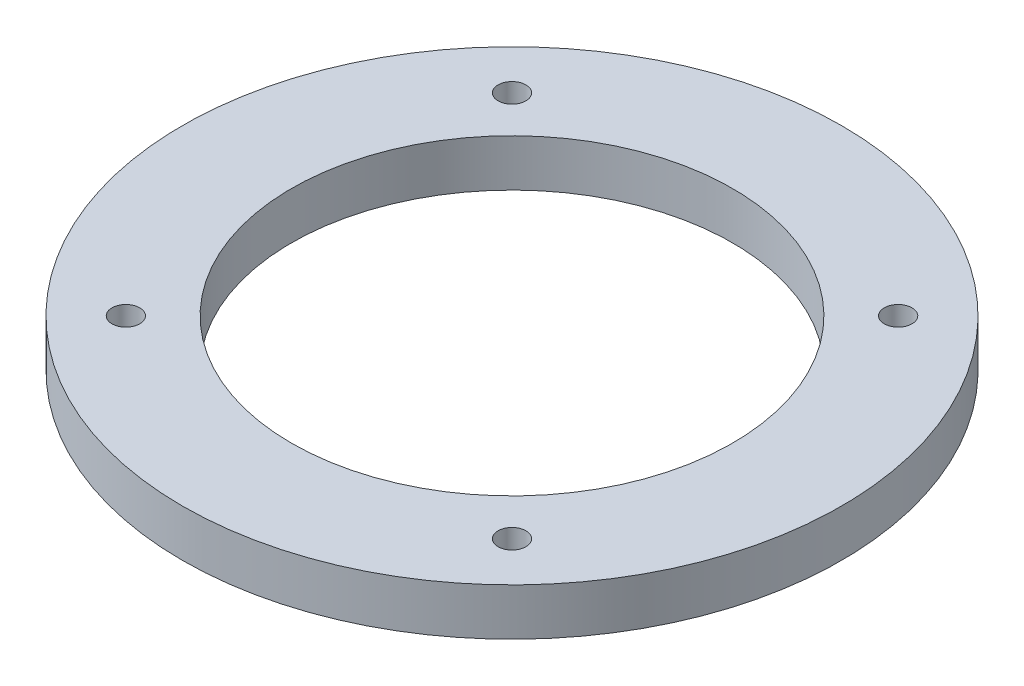
ISO-10303-21;
HEADER;
FILE_DESCRIPTION(('STEP AP214'),'2;1');
FILE_NAME('part.step','',(''),(''),'','','');
FILE_SCHEMA(('AUTOMOTIVE_DESIGN { 1 0 10303 214 1 1 1 1 }'));
ENDSEC;
DATA;
#1=APPLICATION_CONTEXT('core data for automotive mechanical design processes');
#2=APPLICATION_PROTOCOL_DEFINITION('international standard','automotive_design',2000,#1);
#3=PRODUCT_CONTEXT('',#1,'mechanical');
#4=PRODUCT('Part','Part','',(#3));
#5=PRODUCT_RELATED_PRODUCT_CATEGORY('part','',(#4));
#6=PRODUCT_DEFINITION_FORMATION('','',#4);
#7=PRODUCT_DEFINITION_CONTEXT('part definition',#1,'design');
#8=PRODUCT_DEFINITION('design','',#6,#7);
#9=PRODUCT_DEFINITION_SHAPE('','',#8);
#10=(LENGTH_UNIT() NAMED_UNIT(*) SI_UNIT(.MILLI.,.METRE.));
#11=(NAMED_UNIT(*) PLANE_ANGLE_UNIT() SI_UNIT($,.RADIAN.));
#12=(NAMED_UNIT(*) SI_UNIT($,.STERADIAN.) SOLID_ANGLE_UNIT());
#13=UNCERTAINTY_MEASURE_WITH_UNIT(LENGTH_MEASURE(1.E-05),#10,'distance_accuracy_value','');
#14=(GEOMETRIC_REPRESENTATION_CONTEXT(3) GLOBAL_UNCERTAINTY_ASSIGNED_CONTEXT((#13)) GLOBAL_UNIT_ASSIGNED_CONTEXT((#10,
#11,#12)) REPRESENTATION_CONTEXT('',''));
#15=CARTESIAN_POINT('',(0.,0.,0.));
#16=DIRECTION('',(0.,0.,1.));
#17=DIRECTION('',(1.,0.,0.));
#18=AXIS2_PLACEMENT_3D('',#15,#16,#17);
#19=CARTESIAN_POINT('',(0.,2.5,0.));
#20=DIRECTION('',(0.,1.,0.));
#21=DIRECTION('',(0.,0.,1.));
#22=AXIS2_PLACEMENT_3D('',#19,#20,#21);
#23=PLANE('',#22);
#24=CARTESIAN_POINT('',(20.505,2.5,20.505));
#25=DIRECTION('',(0.,1.,0.));
#26=DIRECTION('',(0.,0.,1.));
#27=AXIS2_PLACEMENT_3D('',#24,#25,#26);
#28=CIRCLE('',#27,1.475);
#29=CARTESIAN_POINT('',(20.505,2.5,21.98));
#30=VERTEX_POINT('',#29);
#31=EDGE_CURVE('E66',#30,#30,#28,.T.);
#32=ORIENTED_EDGE('',*,*,#31,.F.);
#33=EDGE_LOOP('',(#32));
#34=FACE_BOUND('',#33,.T.);
#35=CARTESIAN_POINT('',(-20.505,2.5,-20.505));
#36=DIRECTION('',(0.,1.,0.));
#37=DIRECTION('',(0.,0.,1.));
#38=AXIS2_PLACEMENT_3D('',#35,#36,#37);
#39=CIRCLE('',#38,1.475);
#40=CARTESIAN_POINT('',(-20.505,2.5,-19.03));
#41=VERTEX_POINT('',#40);
#42=EDGE_CURVE('E54',#41,#41,#39,.T.);
#43=ORIENTED_EDGE('',*,*,#42,.F.);
#44=EDGE_LOOP('',(#43));
#45=FACE_BOUND('',#44,.T.);
#46=CARTESIAN_POINT('',(0.,2.5,0.));
#47=DIRECTION('',(0.,1.,0.));
#48=DIRECTION('',(0.,0.,1.));
#49=AXIS2_PLACEMENT_3D('',#46,#47,#48);
#50=CIRCLE('',#49,35.);
#51=CARTESIAN_POINT('',(0.,2.5,35.));
#52=VERTEX_POINT('',#51);
#53=EDGE_CURVE('E10',#52,#52,#50,.T.);
#54=ORIENTED_EDGE('',*,*,#53,.T.);
#55=EDGE_LOOP('',(#54));
#56=FACE_BOUND('',#55,.T.);
#57=CARTESIAN_POINT('',(0.,2.5,0.));
#58=DIRECTION('',(0.,1.,0.));
#59=DIRECTION('',(0.,0.,1.));
#60=AXIS2_PLACEMENT_3D('',#57,#58,#59);
#61=CIRCLE('',#60,23.425);
#62=CARTESIAN_POINT('',(0.,2.5,23.425));
#63=VERTEX_POINT('',#62);
#64=EDGE_CURVE('E49',#63,#63,#61,.T.);
#65=ORIENTED_EDGE('',*,*,#64,.F.);
#66=EDGE_LOOP('',(#65));
#67=FACE_BOUND('',#66,.T.);
#68=CARTESIAN_POINT('',(20.505,2.5,-20.505));
#69=DIRECTION('',(0.,1.,0.));
#70=DIRECTION('',(0.,0.,-1.));
#71=AXIS2_PLACEMENT_3D('',#68,#69,#70);
#72=CIRCLE('',#71,1.475);
#73=CARTESIAN_POINT('',(20.505,2.5,-21.98));
#74=VERTEX_POINT('',#73);
#75=EDGE_CURVE('E60',#74,#74,#72,.T.);
#76=ORIENTED_EDGE('',*,*,#75,.F.);
#77=EDGE_LOOP('',(#76));
#78=FACE_BOUND('',#77,.T.);
#79=CARTESIAN_POINT('',(-20.505,2.5,20.505));
#80=DIRECTION('',(0.,1.,0.));
#81=DIRECTION('',(0.,0.,-1.));
#82=AXIS2_PLACEMENT_3D('',#79,#80,#81);
#83=CIRCLE('',#82,1.475);
#84=CARTESIAN_POINT('',(-20.505,2.5,19.03));
#85=VERTEX_POINT('',#84);
#86=EDGE_CURVE('E72',#85,#85,#83,.T.);
#87=ORIENTED_EDGE('',*,*,#86,.F.);
#88=EDGE_LOOP('',(#87));
#89=FACE_BOUND('',#88,.T.);
#90=ADVANCED_FACE('F38',(#34,#45,#56,#67,#78,#89),#23,.T.);
#91=CARTESIAN_POINT('',(0.,-2.5,0.));
#92=DIRECTION('',(0.,1.,0.));
#93=DIRECTION('',(0.,0.,1.));
#94=AXIS2_PLACEMENT_3D('',#91,#92,#93);
#95=PLANE('',#94);
#96=CARTESIAN_POINT('',(0.,-2.5,0.));
#97=DIRECTION('',(0.,1.,0.));
#98=DIRECTION('',(0.,0.,1.));
#99=AXIS2_PLACEMENT_3D('',#96,#97,#98);
#100=CIRCLE('',#99,35.);
#101=CARTESIAN_POINT('',(0.,-2.5,35.));
#102=VERTEX_POINT('',#101);
#103=EDGE_CURVE('E42',#102,#102,#100,.T.);
#104=ORIENTED_EDGE('',*,*,#103,.F.);
#105=EDGE_LOOP('',(#104));
#106=FACE_BOUND('',#105,.T.);
#107=CARTESIAN_POINT('',(0.,-2.5,0.));
#108=DIRECTION('',(0.,1.,0.));
#109=DIRECTION('',(0.,0.,1.));
#110=AXIS2_PLACEMENT_3D('',#107,#108,#109);
#111=CIRCLE('',#110,23.425);
#112=CARTESIAN_POINT('',(0.,-2.5,23.425));
#113=VERTEX_POINT('',#112);
#114=EDGE_CURVE('E51',#113,#113,#111,.T.);
#115=ORIENTED_EDGE('',*,*,#114,.T.);
#116=EDGE_LOOP('',(#115));
#117=FACE_BOUND('',#116,.T.);
#118=CARTESIAN_POINT('',(-20.505,-2.5,-20.505));
#119=DIRECTION('',(0.,1.,0.));
#120=DIRECTION('',(0.,0.,1.));
#121=AXIS2_PLACEMENT_3D('',#118,#119,#120);
#122=CIRCLE('',#121,1.475);
#123=CARTESIAN_POINT('',(-20.505,-2.5,-19.03));
#124=VERTEX_POINT('',#123);
#125=EDGE_CURVE('E57',#124,#124,#122,.T.);
#126=ORIENTED_EDGE('',*,*,#125,.T.);
#127=EDGE_LOOP('',(#126));
#128=FACE_BOUND('',#127,.T.);
#129=CARTESIAN_POINT('',(20.505,-2.5,-20.505));
#130=DIRECTION('',(0.,1.,0.));
#131=DIRECTION('',(0.,0.,-1.));
#132=AXIS2_PLACEMENT_3D('',#129,#130,#131);
#133=CIRCLE('',#132,1.475);
#134=CARTESIAN_POINT('',(20.505,-2.5,-21.98));
#135=VERTEX_POINT('',#134);
#136=EDGE_CURVE('E63',#135,#135,#133,.T.);
#137=ORIENTED_EDGE('',*,*,#136,.T.);
#138=EDGE_LOOP('',(#137));
#139=FACE_BOUND('',#138,.T.);
#140=CARTESIAN_POINT('',(20.505,-2.5,20.505));
#141=DIRECTION('',(0.,1.,0.));
#142=DIRECTION('',(0.,0.,1.));
#143=AXIS2_PLACEMENT_3D('',#140,#141,#142);
#144=CIRCLE('',#143,1.475);
#145=CARTESIAN_POINT('',(20.505,-2.5,21.98));
#146=VERTEX_POINT('',#145);
#147=EDGE_CURVE('E69',#146,#146,#144,.T.);
#148=ORIENTED_EDGE('',*,*,#147,.T.);
#149=EDGE_LOOP('',(#148));
#150=FACE_BOUND('',#149,.T.);
#151=CARTESIAN_POINT('',(-20.505,-2.5,20.505));
#152=DIRECTION('',(0.,1.,0.));
#153=DIRECTION('',(0.,0.,-1.));
#154=AXIS2_PLACEMENT_3D('',#151,#152,#153);
#155=CIRCLE('',#154,1.475);
#156=CARTESIAN_POINT('',(-20.505,-2.5,19.03));
#157=VERTEX_POINT('',#156);
#158=EDGE_CURVE('E75',#157,#157,#155,.T.);
#159=ORIENTED_EDGE('',*,*,#158,.T.);
#160=EDGE_LOOP('',(#159));
#161=FACE_BOUND('',#160,.T.);
#162=ADVANCED_FACE('F85',(#106,#117,#128,#139,#150,#161),#95,.F.);
#163=CARTESIAN_POINT('',(0.,2.5,0.));
#164=DIRECTION('',(0.,-1.,0.));
#165=DIRECTION('',(0.,0.,-1.));
#166=AXIS2_PLACEMENT_3D('',#163,#164,#165);
#167=CYLINDRICAL_SURFACE('',#166,35.);
#168=ORIENTED_EDGE('',*,*,#53,.F.);
#169=EDGE_LOOP('',(#168));
#170=FACE_BOUND('',#169,.T.);
#171=ORIENTED_EDGE('',*,*,#103,.T.);
#172=EDGE_LOOP('',(#171));
#173=FACE_BOUND('',#172,.T.);
#174=ADVANCED_FACE('F40',(#170,#173),#167,.T.);
#175=CARTESIAN_POINT('',(0.,2.5,0.));
#176=DIRECTION('',(0.,-1.,0.));
#177=DIRECTION('',(0.,0.,-1.));
#178=AXIS2_PLACEMENT_3D('',#175,#176,#177);
#179=CYLINDRICAL_SURFACE('',#178,23.425);
#180=ORIENTED_EDGE('',*,*,#64,.T.);
#181=EDGE_LOOP('',(#180));
#182=FACE_BOUND('',#181,.T.);
#183=ORIENTED_EDGE('',*,*,#114,.F.);
#184=EDGE_LOOP('',(#183));
#185=FACE_BOUND('',#184,.T.);
#186=ADVANCED_FACE('F95',(#182,#185),#179,.F.);
#187=CARTESIAN_POINT('',(-20.505,2.5,-20.505));
#188=DIRECTION('',(0.,-1.,0.));
#189=DIRECTION('',(0.,0.,-1.));
#190=AXIS2_PLACEMENT_3D('',#187,#188,#189);
#191=CYLINDRICAL_SURFACE('',#190,1.475);
#192=ORIENTED_EDGE('',*,*,#42,.T.);
#193=EDGE_LOOP('',(#192));
#194=FACE_BOUND('',#193,.T.);
#195=ORIENTED_EDGE('',*,*,#125,.F.);
#196=EDGE_LOOP('',(#195));
#197=FACE_BOUND('',#196,.T.);
#198=ADVANCED_FACE('F98',(#194,#197),#191,.F.);
#199=CARTESIAN_POINT('',(20.505,2.5,-20.505));
#200=DIRECTION('',(0.,-1.,0.));
#201=DIRECTION('',(0.,0.,-1.));
#202=AXIS2_PLACEMENT_3D('',#199,#200,#201);
#203=CYLINDRICAL_SURFACE('',#202,1.475);
#204=ORIENTED_EDGE('',*,*,#75,.T.);
#205=EDGE_LOOP('',(#204));
#206=FACE_BOUND('',#205,.T.);
#207=ORIENTED_EDGE('',*,*,#136,.F.);
#208=EDGE_LOOP('',(#207));
#209=FACE_BOUND('',#208,.T.);
#210=ADVANCED_FACE('F102',(#206,#209),#203,.F.);
#211=CARTESIAN_POINT('',(20.505,2.5,20.505));
#212=DIRECTION('',(0.,-1.,0.));
#213=DIRECTION('',(0.,0.,-1.));
#214=AXIS2_PLACEMENT_3D('',#211,#212,#213);
#215=CYLINDRICAL_SURFACE('',#214,1.475);
#216=ORIENTED_EDGE('',*,*,#31,.T.);
#217=EDGE_LOOP('',(#216));
#218=FACE_BOUND('',#217,.T.);
#219=ORIENTED_EDGE('',*,*,#147,.F.);
#220=EDGE_LOOP('',(#219));
#221=FACE_BOUND('',#220,.T.);
#222=ADVANCED_FACE('F106',(#218,#221),#215,.F.);
#223=CARTESIAN_POINT('',(-20.505,2.5,20.505));
#224=DIRECTION('',(0.,-1.,0.));
#225=DIRECTION('',(0.,0.,-1.));
#226=AXIS2_PLACEMENT_3D('',#223,#224,#225);
#227=CYLINDRICAL_SURFACE('',#226,1.475);
#228=ORIENTED_EDGE('',*,*,#86,.T.);
#229=EDGE_LOOP('',(#228));
#230=FACE_BOUND('',#229,.T.);
#231=ORIENTED_EDGE('',*,*,#158,.F.);
#232=EDGE_LOOP('',(#231));
#233=FACE_BOUND('',#232,.T.);
#234=ADVANCED_FACE('F81',(#230,#233),#227,.F.);
#235=CLOSED_SHELL('',(#90,#162,#174,#186,#198,#210,#222,#234));
#236=MANIFOLD_SOLID_BREP('B2',#235);
#237=ADVANCED_BREP_SHAPE_REPRESENTATION('',(#18,#236),#14);
#238=SHAPE_DEFINITION_REPRESENTATION(#9,#237);
ENDSEC;
END-ISO-10303-21;
